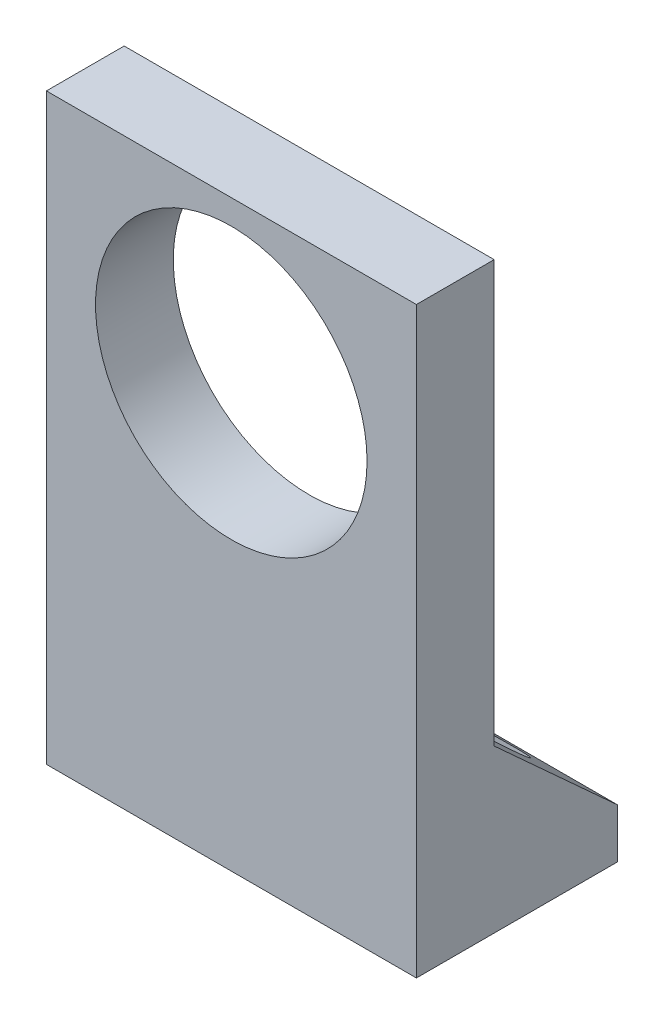
ISO-10303-21;
HEADER;
FILE_DESCRIPTION(('STEP AP214'),'2;1');
FILE_NAME('part.step','',(''),(''),'','','');
FILE_SCHEMA(('AUTOMOTIVE_DESIGN { 1 0 10303 214 1 1 1 1 }'));
ENDSEC;
DATA;
#1=APPLICATION_CONTEXT('core data for automotive mechanical design processes');
#2=APPLICATION_PROTOCOL_DEFINITION('international standard','automotive_design',2000,#1);
#3=PRODUCT_CONTEXT('',#1,'mechanical');
#4=PRODUCT('Part','Part','',(#3));
#5=PRODUCT_RELATED_PRODUCT_CATEGORY('part','',(#4));
#6=PRODUCT_DEFINITION_FORMATION('','',#4);
#7=PRODUCT_DEFINITION_CONTEXT('part definition',#1,'design');
#8=PRODUCT_DEFINITION('design','',#6,#7);
#9=PRODUCT_DEFINITION_SHAPE('','',#8);
#10=(LENGTH_UNIT() NAMED_UNIT(*) SI_UNIT(.MILLI.,.METRE.));
#11=(NAMED_UNIT(*) PLANE_ANGLE_UNIT() SI_UNIT($,.RADIAN.));
#12=(NAMED_UNIT(*) SI_UNIT($,.STERADIAN.) SOLID_ANGLE_UNIT());
#13=UNCERTAINTY_MEASURE_WITH_UNIT(LENGTH_MEASURE(1.E-05),#10,'distance_accuracy_value','');
#14=(GEOMETRIC_REPRESENTATION_CONTEXT(3) GLOBAL_UNCERTAINTY_ASSIGNED_CONTEXT((#13)) GLOBAL_UNIT_ASSIGNED_CONTEXT((#10,
#11,#12)) REPRESENTATION_CONTEXT('',''));
#15=CARTESIAN_POINT('',(0.,0.,0.));
#16=DIRECTION('',(0.,0.,1.));
#17=DIRECTION('',(1.,0.,0.));
#18=AXIS2_PLACEMENT_3D('',#15,#16,#17);
#19=CARTESIAN_POINT('',(0.,0.,-27.));
#20=DIRECTION('',(0.,0.,1.));
#21=DIRECTION('',(1.,0.,0.));
#22=AXIS2_PLACEMENT_3D('',#19,#20,#21);
#23=PLANE('',#22);
#24=CARTESIAN_POINT('',(-53.1870503597122,36.9280575539568,-27.));
#25=DIRECTION('',(0.,0.,1.));
#26=DIRECTION('',(1.,0.,0.));
#27=AXIS2_PLACEMENT_3D('',#24,#25,#26);
#28=CIRCLE('',#27,11.);
#29=CARTESIAN_POINT('',(-42.1870503597123,36.9280575539568,-27.));
#30=VERTEX_POINT('',#29);
#31=EDGE_CURVE('E115',#30,#30,#28,.T.);
#32=ORIENTED_EDGE('',*,*,#31,.T.);
#33=EDGE_LOOP('',(#32));
#34=FACE_BOUND('',#33,.T.);
#35=DIRECTION('',(0.,-1.,0.));
#36=VECTOR('',#35,1.);
#37=CARTESIAN_POINT('',(-38.1870503597122,0.,-27.));
#38=LINE('',#37,#36);
#39=CARTESIAN_POINT('',(-38.1870503597122,49.9280575539568,-27.));
#40=VERTEX_POINT('',#39);
#41=CARTESIAN_POINT('',(-38.1870503597122,15.7954257686406,-27.));
#42=VERTEX_POINT('',#41);
#43=EDGE_CURVE('E103',#40,#42,#38,.T.);
#44=ORIENTED_EDGE('',*,*,#43,.T.);
#45=DIRECTION('',(-1.,0.,0.));
#46=VECTOR('',#45,1.);
#47=CARTESIAN_POINT('',(-38.1870503597122,15.7954257686406,-27.));
#48=LINE('',#47,#46);
#49=CARTESIAN_POINT('',(-68.1660613503876,15.7954257686406,-27.));
#50=VERTEX_POINT('',#49);
#51=EDGE_CURVE('E86',#42,#50,#48,.T.);
#52=ORIENTED_EDGE('',*,*,#51,.T.);
#53=DIRECTION('',(0.,-1.,0.));
#54=VECTOR('',#53,1.);
#55=CARTESIAN_POINT('',(-68.1660613503876,2.66805755395684,-27.));
#56=LINE('',#55,#54);
#57=CARTESIAN_POINT('',(-68.1660613503876,49.9280575539568,-27.));
#58=VERTEX_POINT('',#57);
#59=EDGE_CURVE('E156',#58,#50,#56,.T.);
#60=ORIENTED_EDGE('',*,*,#59,.F.);
#61=DIRECTION('',(1.,0.,0.));
#62=VECTOR('',#61,1.);
#63=CARTESIAN_POINT('',(0.,49.9280575539568,-27.));
#64=LINE('',#63,#62);
#65=EDGE_CURVE('E107',#58,#40,#64,.T.);
#66=ORIENTED_EDGE('',*,*,#65,.T.);
#67=EDGE_LOOP('',(#44,#52,#60,#66));
#68=FACE_BOUND('',#67,.T.);
#69=ADVANCED_FACE('F37',(#34,#68),#23,.F.);
#70=CARTESIAN_POINT('',(-36.1870503597122,18.9280575539568,-20.7));
#71=DIRECTION('',(0.,0.,-1.));
#72=DIRECTION('',(-1.,0.,0.));
#73=AXIS2_PLACEMENT_3D('',#70,#71,#72);
#74=PLANE('',#73);
#75=CARTESIAN_POINT('',(-53.1870503597122,36.9280575539568,-20.7));
#76=DIRECTION('',(0.,0.,1.));
#77=DIRECTION('',(1.,0.,0.));
#78=AXIS2_PLACEMENT_3D('',#75,#76,#77);
#79=CIRCLE('',#78,11.);
#80=CARTESIAN_POINT('',(-42.1870503597123,36.9280575539568,-20.7));
#81=VERTEX_POINT('',#80);
#82=EDGE_CURVE('E117',#81,#81,#79,.T.);
#83=ORIENTED_EDGE('',*,*,#82,.F.);
#84=EDGE_LOOP('',(#83));
#85=FACE_BOUND('',#84,.T.);
#86=DIRECTION('',(0.,1.,0.));
#87=VECTOR('',#86,1.);
#88=CARTESIAN_POINT('',(-38.1870503597122,18.9280575539568,-20.7));
#89=LINE('',#88,#87);
#90=CARTESIAN_POINT('',(-38.1870503597122,2.66805755395684,-20.7));
#91=VERTEX_POINT('',#90);
#92=CARTESIAN_POINT('',(-38.1870503597122,49.9280575539568,-20.7));
#93=VERTEX_POINT('',#92);
#94=EDGE_CURVE('E108',#91,#93,#89,.T.);
#95=ORIENTED_EDGE('',*,*,#94,.T.);
#96=DIRECTION('',(1.,0.,0.));
#97=VECTOR('',#96,1.);
#98=CARTESIAN_POINT('',(-38.1870503597122,49.9280575539568,-20.7));
#99=LINE('',#98,#97);
#100=CARTESIAN_POINT('',(-68.1660613503876,49.9280575539568,-20.7));
#101=VERTEX_POINT('',#100);
#102=EDGE_CURVE('E53',#101,#93,#99,.T.);
#103=ORIENTED_EDGE('',*,*,#102,.F.);
#104=DIRECTION('',(0.,1.,0.));
#105=VECTOR('',#104,1.);
#106=CARTESIAN_POINT('',(-68.1660613503876,49.9280575539568,-20.7));
#107=LINE('',#106,#105);
#108=CARTESIAN_POINT('',(-68.1660613503876,2.66805755395684,-20.7));
#109=VERTEX_POINT('',#108);
#110=EDGE_CURVE('E161',#109,#101,#107,.T.);
#111=ORIENTED_EDGE('',*,*,#110,.F.);
#112=DIRECTION('',(-1.,0.,0.));
#113=VECTOR('',#112,1.);
#114=CARTESIAN_POINT('',(-18.1660613503876,2.66805755395684,-20.7));
#115=LINE('',#114,#113);
#116=EDGE_CURVE('E153',#91,#109,#115,.T.);
#117=ORIENTED_EDGE('',*,*,#116,.F.);
#118=EDGE_LOOP('',(#95,#103,#111,#117));
#119=FACE_BOUND('',#118,.T.);
#120=ADVANCED_FACE('F174',(#85,#119),#74,.F.);
#121=CARTESIAN_POINT('',(-38.1870503597122,0.128057553956839,-34.7));
#122=DIRECTION('',(-1.,0.,0.));
#123=DIRECTION('',(0.,0.,1.));
#124=AXIS2_PLACEMENT_3D('',#121,#122,#123);
#125=PLANE('',#124);
#126=DIRECTION('',(0.,-0.674145832448532,-0.738598264682687));
#127=VECTOR('',#126,1.);
#128=CARTESIAN_POINT('',(-38.1870503597122,15.7954257686406,-27.));
#129=LINE('',#128,#127);
#130=CARTESIAN_POINT('',(-38.1870503597122,6.66805755395684,-37.));
#131=VERTEX_POINT('',#130);
#132=EDGE_CURVE('E89',#42,#131,#129,.T.);
#133=ORIENTED_EDGE('',*,*,#132,.F.);
#134=ORIENTED_EDGE('',*,*,#43,.F.);
#135=DIRECTION('',(0.,0.,1.));
#136=VECTOR('',#135,1.);
#137=CARTESIAN_POINT('',(-38.1870503597122,49.9280575539568,-34.7));
#138=LINE('',#137,#136);
#139=EDGE_CURVE('E45',#40,#93,#138,.T.);
#140=ORIENTED_EDGE('',*,*,#139,.T.);
#141=ORIENTED_EDGE('',*,*,#94,.F.);
#142=DIRECTION('',(0.,0.,-1.));
#143=VECTOR('',#142,1.);
#144=CARTESIAN_POINT('',(-38.1870503597122,2.66805755395684,-34.7));
#145=LINE('',#144,#143);
#146=CARTESIAN_POINT('',(-38.1870503597122,2.66805755395684,-37.));
#147=VERTEX_POINT('',#146);
#148=EDGE_CURVE('E11',#91,#147,#145,.T.);
#149=ORIENTED_EDGE('',*,*,#148,.T.);
#150=DIRECTION('',(0.,-1.,0.));
#151=VECTOR('',#150,1.);
#152=CARTESIAN_POINT('',(-38.1870503597122,2.66805755395684,-37.));
#153=LINE('',#152,#151);
#154=EDGE_CURVE('E105',#131,#147,#153,.T.);
#155=ORIENTED_EDGE('',*,*,#154,.F.);
#156=EDGE_LOOP('',(#133,#134,#140,#141,#149,#155));
#157=FACE_BOUND('',#156,.T.);
#158=ADVANCED_FACE('F102',(#157),#125,.F.);
#159=CARTESIAN_POINT('',(-38.1870503597122,49.9280575539568,-50.7));
#160=DIRECTION('',(0.,-1.,0.));
#161=DIRECTION('',(0.,0.,-1.));
#162=AXIS2_PLACEMENT_3D('',#159,#160,#161);
#163=PLANE('',#162);
#164=ORIENTED_EDGE('',*,*,#65,.F.);
#165=DIRECTION('',(0.,0.,-1.));
#166=VECTOR('',#165,1.);
#167=CARTESIAN_POINT('',(-68.1660613503876,49.9280575539568,-27.));
#168=LINE('',#167,#166);
#169=EDGE_CURVE('E164',#101,#58,#168,.T.);
#170=ORIENTED_EDGE('',*,*,#169,.F.);
#171=ORIENTED_EDGE('',*,*,#102,.T.);
#172=ORIENTED_EDGE('',*,*,#139,.F.);
#173=EDGE_LOOP('',(#164,#170,#171,#172));
#174=FACE_BOUND('',#173,.T.);
#175=ADVANCED_FACE('F187',(#174),#163,.F.);
#176=CARTESIAN_POINT('',(-65.8660613503876,2.66805755395684,-114.7));
#177=DIRECTION('',(0.,1.,0.));
#178=DIRECTION('',(0.,0.,1.));
#179=AXIS2_PLACEMENT_3D('',#176,#177,#178);
#180=PLANE('',#179);
#181=CARTESIAN_POINT('',(-45.1870503597122,2.66805755395684,-32.));
#182=DIRECTION('',(0.,1.,0.));
#183=DIRECTION('',(0.,0.,1.));
#184=AXIS2_PLACEMENT_3D('',#181,#182,#183);
#185=CIRCLE('',#184,2.);
#186=CARTESIAN_POINT('',(-45.1870503597122,2.66805755395684,-30.));
#187=VERTEX_POINT('',#186);
#188=EDGE_CURVE('E141',#187,#187,#185,.T.);
#189=ORIENTED_EDGE('',*,*,#188,.T.);
#190=EDGE_LOOP('',(#189));
#191=FACE_BOUND('',#190,.T.);
#192=CARTESIAN_POINT('',(-61.1660613503876,2.66805755395684,-32.));
#193=DIRECTION('',(0.,1.,0.));
#194=DIRECTION('',(0.,0.,1.));
#195=AXIS2_PLACEMENT_3D('',#192,#193,#194);
#196=CIRCLE('',#195,2.);
#197=CARTESIAN_POINT('',(-61.1660613503876,2.66805755395684,-30.));
#198=VERTEX_POINT('',#197);
#199=EDGE_CURVE('E97',#198,#198,#196,.T.);
#200=ORIENTED_EDGE('',*,*,#199,.T.);
#201=EDGE_LOOP('',(#200));
#202=FACE_BOUND('',#201,.T.);
#203=ORIENTED_EDGE('',*,*,#148,.F.);
#204=ORIENTED_EDGE('',*,*,#116,.T.);
#205=DIRECTION('',(0.,0.,1.));
#206=VECTOR('',#205,1.);
#207=CARTESIAN_POINT('',(-68.1660613503876,2.66805755395684,-4.69999999999999));
#208=LINE('',#207,#206);
#209=CARTESIAN_POINT('',(-68.1660613503876,2.66805755395684,-37.));
#210=VERTEX_POINT('',#209);
#211=EDGE_CURVE('E158',#210,#109,#208,.T.);
#212=ORIENTED_EDGE('',*,*,#211,.F.);
#213=DIRECTION('',(-1.,0.,0.));
#214=VECTOR('',#213,1.);
#215=CARTESIAN_POINT('',(-38.1870503597122,2.66805755395684,-37.));
#216=LINE('',#215,#214);
#217=EDGE_CURVE('E145',#147,#210,#216,.T.);
#218=ORIENTED_EDGE('',*,*,#217,.F.);
#219=EDGE_LOOP('',(#203,#204,#212,#218));
#220=FACE_BOUND('',#219,.T.);
#221=ADVANCED_FACE('F181',(#191,#202,#220),#180,.F.);
#222=CARTESIAN_POINT('',(-53.1870503597122,36.9280575539568,-40.7));
#223=DIRECTION('',(0.,0.,1.));
#224=DIRECTION('',(1.,0.,0.));
#225=AXIS2_PLACEMENT_3D('',#222,#223,#224);
#226=CYLINDRICAL_SURFACE('',#225,11.);
#227=ORIENTED_EDGE('',*,*,#82,.T.);
#228=EDGE_LOOP('',(#227));
#229=FACE_BOUND('',#228,.T.);
#230=ORIENTED_EDGE('',*,*,#31,.F.);
#231=EDGE_LOOP('',(#230));
#232=FACE_BOUND('',#231,.T.);
#233=ADVANCED_FACE('F171',(#229,#232),#226,.F.);
#234=CARTESIAN_POINT('',(-68.1660613503876,0.,0.));
#235=DIRECTION('',(1.,0.,0.));
#236=DIRECTION('',(0.,0.,-1.));
#237=AXIS2_PLACEMENT_3D('',#234,#235,#236);
#238=PLANE('',#237);
#239=ORIENTED_EDGE('',*,*,#59,.T.);
#240=DIRECTION('',(0.,-0.674145832448532,-0.738598264682687));
#241=VECTOR('',#240,1.);
#242=CARTESIAN_POINT('',(-68.1660613503876,15.7954257686406,-27.));
#243=LINE('',#242,#241);
#244=CARTESIAN_POINT('',(-68.1660613503876,6.66805755395684,-37.));
#245=VERTEX_POINT('',#244);
#246=EDGE_CURVE('E92',#50,#245,#243,.T.);
#247=ORIENTED_EDGE('',*,*,#246,.T.);
#248=DIRECTION('',(0.,1.,0.));
#249=VECTOR('',#248,1.);
#250=CARTESIAN_POINT('',(-68.1660613503876,2.66805755395684,-37.));
#251=LINE('',#250,#249);
#252=EDGE_CURVE('E148',#210,#245,#251,.T.);
#253=ORIENTED_EDGE('',*,*,#252,.F.);
#254=ORIENTED_EDGE('',*,*,#211,.T.);
#255=ORIENTED_EDGE('',*,*,#110,.T.);
#256=ORIENTED_EDGE('',*,*,#169,.T.);
#257=EDGE_LOOP('',(#239,#247,#253,#254,#255,#256));
#258=FACE_BOUND('',#257,.T.);
#259=ADVANCED_FACE('F186',(#258),#238,.F.);
#260=CARTESIAN_POINT('',(0.,0.,-37.));
#261=DIRECTION('',(0.,0.,1.));
#262=DIRECTION('',(1.,0.,0.));
#263=AXIS2_PLACEMENT_3D('',#260,#261,#262);
#264=PLANE('',#263);
#265=ORIENTED_EDGE('',*,*,#154,.T.);
#266=ORIENTED_EDGE('',*,*,#217,.T.);
#267=ORIENTED_EDGE('',*,*,#252,.T.);
#268=DIRECTION('',(1.,0.,0.));
#269=VECTOR('',#268,1.);
#270=CARTESIAN_POINT('',(-38.1870503597122,6.66805755395684,-37.));
#271=LINE('',#270,#269);
#272=EDGE_CURVE('E151',#245,#131,#271,.T.);
#273=ORIENTED_EDGE('',*,*,#272,.T.);
#274=EDGE_LOOP('',(#265,#266,#267,#273));
#275=FACE_BOUND('',#274,.T.);
#276=ADVANCED_FACE('F184',(#275),#264,.F.);
#277=CARTESIAN_POINT('',(-61.1660613503876,-3.33194244604316,-32.));
#278=DIRECTION('',(0.,1.,0.));
#279=DIRECTION('',(0.,0.,1.));
#280=AXIS2_PLACEMENT_3D('',#277,#278,#279);
#281=CYLINDRICAL_SURFACE('',#280,2.);
#282=CARTESIAN_POINT('',(-61.1660613503876,6.66805755395684,-32.));
#283=DIRECTION('',(0.,-1.,0.));
#284=DIRECTION('',(0.,0.,-1.));
#285=AXIS2_PLACEMENT_3D('',#282,#283,#284);
#286=CIRCLE('',#285,2.);
#287=CARTESIAN_POINT('',(-61.1660613503876,6.66805755395684,-34.));
#288=VERTEX_POINT('',#287);
#289=EDGE_CURVE('E124',#288,#288,#286,.F.);
#290=ORIENTED_EDGE('',*,*,#289,.T.);
#291=EDGE_LOOP('',(#290));
#292=FACE_BOUND('',#291,.T.);
#293=ORIENTED_EDGE('',*,*,#199,.F.);
#294=EDGE_LOOP('',(#293));
#295=FACE_BOUND('',#294,.T.);
#296=ADVANCED_FACE('F213',(#292,#295),#281,.F.);
#297=CARTESIAN_POINT('',(-45.1870503597122,-3.33194244604316,-32.));
#298=DIRECTION('',(0.,1.,0.));
#299=DIRECTION('',(0.,0.,1.));
#300=AXIS2_PLACEMENT_3D('',#297,#298,#299);
#301=CYLINDRICAL_SURFACE('',#300,2.);
#302=CARTESIAN_POINT('',(-45.1870503597122,6.66805755395684,-32.));
#303=DIRECTION('',(0.,-1.,0.));
#304=DIRECTION('',(0.,0.,-1.));
#305=AXIS2_PLACEMENT_3D('',#302,#303,#304);
#306=CIRCLE('',#305,2.);
#307=CARTESIAN_POINT('',(-45.1870503597122,6.66805755395684,-34.));
#308=VERTEX_POINT('',#307);
#309=EDGE_CURVE('E133',#308,#308,#306,.F.);
#310=ORIENTED_EDGE('',*,*,#309,.T.);
#311=EDGE_LOOP('',(#310));
#312=FACE_BOUND('',#311,.T.);
#313=ORIENTED_EDGE('',*,*,#188,.F.);
#314=EDGE_LOOP('',(#313));
#315=FACE_BOUND('',#314,.T.);
#316=ADVANCED_FACE('F216',(#312,#315),#301,.F.);
#317=CARTESIAN_POINT('',(-38.1870503597122,15.7954257686406,-27.));
#318=DIRECTION('',(0.,0.738598264682687,-0.674145832448532));
#319=DIRECTION('',(0.,0.674145832448532,0.738598264682687));
#320=AXIS2_PLACEMENT_3D('',#317,#318,#319);
#321=PLANE('',#320);
#322=CARTESIAN_POINT('',(-61.1660613503876,11.2317416612987,-32.));
#323=DIRECTION('',(0.,0.738598264682687,-0.674145832448532));
#324=DIRECTION('',(0.,-0.674145832448532,-0.738598264682687));
#325=AXIS2_PLACEMENT_3D('',#322,#323,#324);
#326=ELLIPSE('',#325,4.73870596149269,3.5);
#327=CARTESIAN_POINT('',(-61.1660613503876,8.0371627861594,-35.5));
#328=VERTEX_POINT('',#327);
#329=EDGE_CURVE('E40',#328,#328,#326,.T.);
#330=ORIENTED_EDGE('',*,*,#329,.F.);
#331=EDGE_LOOP('',(#330));
#332=FACE_BOUND('',#331,.T.);
#333=CARTESIAN_POINT('',(-45.1870503597122,11.2317416612987,-32.));
#334=DIRECTION('',(0.,0.738598264682687,-0.674145832448532));
#335=DIRECTION('',(0.,-0.674145832448532,-0.738598264682687));
#336=AXIS2_PLACEMENT_3D('',#333,#334,#335);
#337=ELLIPSE('',#336,4.73870596149269,3.5);
#338=CARTESIAN_POINT('',(-45.1870503597122,8.0371627861594,-35.5));
#339=VERTEX_POINT('',#338);
#340=EDGE_CURVE('E118',#339,#339,#337,.T.);
#341=ORIENTED_EDGE('',*,*,#340,.F.);
#342=EDGE_LOOP('',(#341));
#343=FACE_BOUND('',#342,.T.);
#344=ORIENTED_EDGE('',*,*,#246,.F.);
#345=ORIENTED_EDGE('',*,*,#51,.F.);
#346=ORIENTED_EDGE('',*,*,#132,.T.);
#347=ORIENTED_EDGE('',*,*,#272,.F.);
#348=EDGE_LOOP('',(#344,#345,#346,#347));
#349=FACE_BOUND('',#348,.T.);
#350=ADVANCED_FACE('F88',(#332,#343,#349),#321,.T.);
#351=CARTESIAN_POINT('',(-45.1870503597122,6.66805755395684,-32.));
#352=DIRECTION('',(0.,-1.,0.));
#353=DIRECTION('',(0.,0.,-1.));
#354=AXIS2_PLACEMENT_3D('',#351,#352,#353);
#355=PLANE('',#354);
#356=CARTESIAN_POINT('',(-45.1870503597122,6.66805755395684,-32.));
#357=DIRECTION('',(0.,-1.,0.));
#358=DIRECTION('',(0.,0.,-1.));
#359=AXIS2_PLACEMENT_3D('',#356,#357,#358);
#360=CIRCLE('',#359,3.5);
#361=CARTESIAN_POINT('',(-45.1870503597122,6.66805755395684,-35.5));
#362=VERTEX_POINT('',#361);
#363=EDGE_CURVE('E126',#362,#362,#360,.T.);
#364=ORIENTED_EDGE('',*,*,#363,.F.);
#365=EDGE_LOOP('',(#364));
#366=FACE_BOUND('',#365,.T.);
#367=ORIENTED_EDGE('',*,*,#309,.F.);
#368=EDGE_LOOP('',(#367));
#369=FACE_BOUND('',#368,.T.);
#370=ADVANCED_FACE('F223',(#366,#369),#355,.F.);
#371=CARTESIAN_POINT('',(-45.1870503597122,16.6680575539568,-32.));
#372=DIRECTION('',(0.,-1.,0.));
#373=DIRECTION('',(0.,0.,-1.));
#374=AXIS2_PLACEMENT_3D('',#371,#372,#373);
#375=CYLINDRICAL_SURFACE('',#374,3.5);
#376=ORIENTED_EDGE('',*,*,#340,.T.);
#377=EDGE_LOOP('',(#376));
#378=FACE_BOUND('',#377,.T.);
#379=ORIENTED_EDGE('',*,*,#363,.T.);
#380=EDGE_LOOP('',(#379));
#381=FACE_BOUND('',#380,.T.);
#382=ADVANCED_FACE('F225',(#378,#381),#375,.F.);
#383=CARTESIAN_POINT('',(-61.1660613503876,6.66805755395684,-32.));
#384=DIRECTION('',(0.,-1.,0.));
#385=DIRECTION('',(0.,0.,-1.));
#386=AXIS2_PLACEMENT_3D('',#383,#384,#385);
#387=PLANE('',#386);
#388=CARTESIAN_POINT('',(-61.1660613503876,6.66805755395684,-32.));
#389=DIRECTION('',(0.,-1.,0.));
#390=DIRECTION('',(0.,0.,-1.));
#391=AXIS2_PLACEMENT_3D('',#388,#389,#390);
#392=CIRCLE('',#391,3.5);
#393=CARTESIAN_POINT('',(-61.1660613503876,6.66805755395684,-35.5));
#394=VERTEX_POINT('',#393);
#395=EDGE_CURVE('E120',#394,#394,#392,.T.);
#396=ORIENTED_EDGE('',*,*,#395,.F.);
#397=EDGE_LOOP('',(#396));
#398=FACE_BOUND('',#397,.T.);
#399=ORIENTED_EDGE('',*,*,#289,.F.);
#400=EDGE_LOOP('',(#399));
#401=FACE_BOUND('',#400,.T.);
#402=ADVANCED_FACE('F228',(#398,#401),#387,.F.);
#403=CARTESIAN_POINT('',(-61.1660613503876,16.6680575539568,-32.));
#404=DIRECTION('',(0.,-1.,0.));
#405=DIRECTION('',(0.,0.,-1.));
#406=AXIS2_PLACEMENT_3D('',#403,#404,#405);
#407=CYLINDRICAL_SURFACE('',#406,3.5);
#408=ORIENTED_EDGE('',*,*,#329,.T.);
#409=EDGE_LOOP('',(#408));
#410=FACE_BOUND('',#409,.T.);
#411=ORIENTED_EDGE('',*,*,#395,.T.);
#412=EDGE_LOOP('',(#411));
#413=FACE_BOUND('',#412,.T.);
#414=ADVANCED_FACE('F232',(#410,#413),#407,.F.);
#415=CLOSED_SHELL('',(#69,#120,#158,#175,#221,#233,#259,#276,#296,#316,#350,#370,#382,#402,#414));
#416=MANIFOLD_SOLID_BREP('B2',#415);
#417=ADVANCED_BREP_SHAPE_REPRESENTATION('',(#18,#416),#14);
#418=SHAPE_DEFINITION_REPRESENTATION(#9,#417);
ENDSEC;
END-ISO-10303-21;
